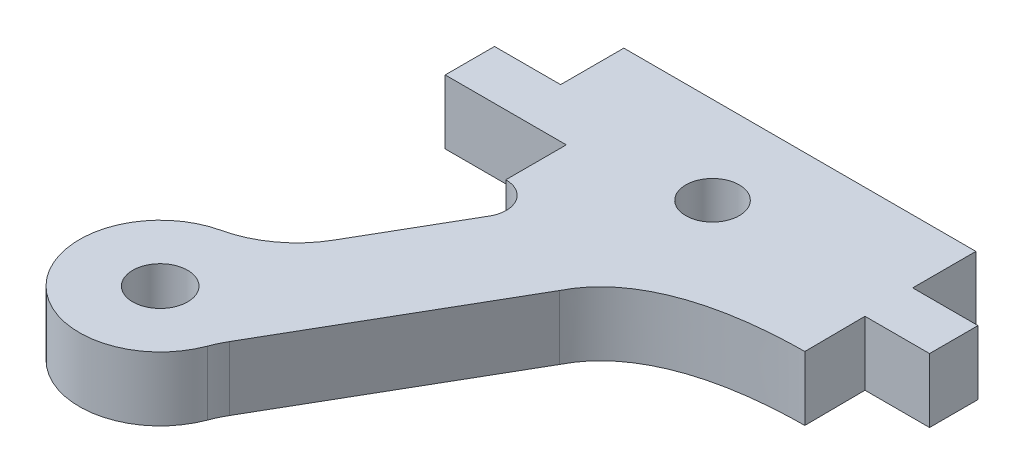
ISO-10303-21;
HEADER;
FILE_DESCRIPTION(('STEP AP214'),'2;1');
FILE_NAME('part.step','',(''),(''),'','','');
FILE_SCHEMA(('AUTOMOTIVE_DESIGN { 1 0 10303 214 1 1 1 1 }'));
ENDSEC;
DATA;
#1=APPLICATION_CONTEXT('core data for automotive mechanical design processes');
#2=APPLICATION_PROTOCOL_DEFINITION('international standard','automotive_design',2000,#1);
#3=PRODUCT_CONTEXT('',#1,'mechanical');
#4=PRODUCT('Part','Part','',(#3));
#5=PRODUCT_RELATED_PRODUCT_CATEGORY('part','',(#4));
#6=PRODUCT_DEFINITION_FORMATION('','',#4);
#7=PRODUCT_DEFINITION_CONTEXT('part definition',#1,'design');
#8=PRODUCT_DEFINITION('design','',#6,#7);
#9=PRODUCT_DEFINITION_SHAPE('','',#8);
#10=(LENGTH_UNIT() NAMED_UNIT(*) SI_UNIT(.MILLI.,.METRE.));
#11=(NAMED_UNIT(*) PLANE_ANGLE_UNIT() SI_UNIT($,.RADIAN.));
#12=(NAMED_UNIT(*) SI_UNIT($,.STERADIAN.) SOLID_ANGLE_UNIT());
#13=UNCERTAINTY_MEASURE_WITH_UNIT(LENGTH_MEASURE(1.E-05),#10,'distance_accuracy_value','');
#14=(GEOMETRIC_REPRESENTATION_CONTEXT(3) GLOBAL_UNCERTAINTY_ASSIGNED_CONTEXT((#13)) GLOBAL_UNIT_ASSIGNED_CONTEXT((#10,
#11,#12)) REPRESENTATION_CONTEXT('',''));
#15=CARTESIAN_POINT('',(0.,0.,0.));
#16=DIRECTION('',(0.,0.,1.));
#17=DIRECTION('',(1.,0.,0.));
#18=AXIS2_PLACEMENT_3D('',#15,#16,#17);
#19=CARTESIAN_POINT('',(117.147916967197,3.175,-107.308257011216));
#20=DIRECTION('',(0.,-1.,0.));
#21=DIRECTION('',(0.,0.,-1.));
#22=AXIS2_PLACEMENT_3D('',#19,#20,#21);
#23=PLANE('',#22);
#24=CARTESIAN_POINT('',(108.7226006299,3.175,-110.472754541073));
#25=DIRECTION('',(0.,1.,0.));
#26=DIRECTION('',(0.,0.,1.));
#27=AXIS2_PLACEMENT_3D('',#24,#25,#26);
#28=CIRCLE('',#27,1.36);
#29=CARTESIAN_POINT('',(108.7226006299,3.175,-109.112754541073));
#30=VERTEX_POINT('',#29);
#31=EDGE_CURVE('E195',#30,#30,#28,.T.);
#32=ORIENTED_EDGE('',*,*,#31,.F.);
#33=EDGE_LOOP('',(#32));
#34=FACE_BOUND('',#33,.T.);
#35=CARTESIAN_POINT('',(117.147916967197,3.175,-107.308257011216));
#36=DIRECTION('',(0.,-1.,0.));
#37=DIRECTION('',(0.,0.,-1.));
#38=AXIS2_PLACEMENT_3D('',#35,#36,#37);
#39=CIRCLE('',#38,5.00000000000112);
#40=CARTESIAN_POINT('',(112.467185668698,3.175,-109.066311194469));
#41=VERTEX_POINT('',#40);
#42=CARTESIAN_POINT('',(112.817819601477,3.175,-109.808308371367));
#43=VERTEX_POINT('',#42);
#44=EDGE_CURVE('E231',#41,#43,#39,.T.);
#45=ORIENTED_EDGE('',*,*,#44,.T.);
#46=DIRECTION('',(0.500010272030281,0.,-0.866019473143765));
#47=VECTOR('',#46,1.);
#48=CARTESIAN_POINT('',(118.803678696097,3.175,-120.175836459114));
#49=LINE('',#48,#47);
#50=CARTESIAN_POINT('',(118.803678696098,3.175,-120.175836459113));
#51=VERTEX_POINT('',#50);
#52=EDGE_CURVE('E124',#43,#51,#49,.T.);
#53=ORIENTED_EDGE('',*,*,#52,.T.);
#54=CARTESIAN_POINT('',(118.803678696098,3.175,-120.175836459113));
#55=CARTESIAN_POINT('',(120.361778696098,3.175,-123.269636459114));
#56=CARTESIAN_POINT('',(125.055778696098,3.175,-123.618636459114));
#57=CARTESIAN_POINT('',(127.497578696098,3.175,-123.636436459114));
#58=B_SPLINE_CURVE_WITH_KNOTS('',3,(#54,#55,#56,#57),.UNSPECIFIED.,.F.,.F.,(4,4),
(0.666666666666667,0.708333333333333),.UNSPECIFIED.);
#59=CARTESIAN_POINT('',(127.497578696098,3.175,-123.636436459114));
#60=VERTEX_POINT('',#59);
#61=EDGE_CURVE('E276',#51,#60,#58,.T.);
#62=ORIENTED_EDGE('',*,*,#61,.T.);
#63=DIRECTION('',(-0.00719981338325912,0.,-0.999974081007726));
#64=VECTOR('',#63,1.);
#65=CARTESIAN_POINT('',(127.475978696098,3.175,-126.636436459114));
#66=LINE('',#65,#64);
#67=CARTESIAN_POINT('',(127.475978696098,3.175,-126.636436459114));
#68=VERTEX_POINT('',#67);
#69=EDGE_CURVE('E295',#60,#68,#66,.T.);
#70=ORIENTED_EDGE('',*,*,#69,.T.);
#71=DIRECTION('',(1.,0.,0.));
#72=VECTOR('',#71,1.);
#73=CARTESIAN_POINT('',(130.675779855545,3.175,-126.636436459114));
#74=LINE('',#73,#72);
#75=CARTESIAN_POINT('',(130.675779855545,3.175,-126.636436459114));
#76=VERTEX_POINT('',#75);
#77=EDGE_CURVE('E292',#68,#76,#74,.T.);
#78=ORIENTED_EDGE('',*,*,#77,.T.);
#79=DIRECTION('',(0.,0.,-1.));
#80=VECTOR('',#79,1.);
#81=CARTESIAN_POINT('',(130.675779855545,3.175,-129.036436459114));
#82=LINE('',#81,#80);
#83=CARTESIAN_POINT('',(130.675779855545,3.175,-129.036436459114));
#84=VERTEX_POINT('',#83);
#85=EDGE_CURVE('E294',#76,#84,#82,.T.);
#86=ORIENTED_EDGE('',*,*,#85,.T.);
#87=DIRECTION('',(-1.,0.,0.));
#88=VECTOR('',#87,1.);
#89=CARTESIAN_POINT('',(130.675779855545,3.175,-129.036436459114));
#90=LINE('',#89,#88);
#91=CARTESIAN_POINT('',(127.440025110759,3.175,-129.036436459114));
#92=VERTEX_POINT('',#91);
#93=EDGE_CURVE('E297',#84,#92,#90,.T.);
#94=ORIENTED_EDGE('',*,*,#93,.T.);
#95=DIRECTION('',(0.,0.,-1.));
#96=VECTOR('',#95,1.);
#97=CARTESIAN_POINT('',(127.440025110759,3.175,-129.036436459114));
#98=LINE('',#97,#96);
#99=CARTESIAN_POINT('',(127.440025110759,3.175,-132.168236459114));
#100=VERTEX_POINT('',#99);
#101=EDGE_CURVE('E303',#92,#100,#98,.T.);
#102=ORIENTED_EDGE('',*,*,#101,.T.);
#103=DIRECTION('',(-1.,0.,0.));
#104=VECTOR('',#103,1.);
#105=CARTESIAN_POINT('',(109.997615957605,3.175,-132.168236459114));
#106=LINE('',#105,#104);
#107=CARTESIAN_POINT('',(109.997615957605,3.175,-132.168236459114));
#108=VERTEX_POINT('',#107);
#109=EDGE_CURVE('E305',#100,#108,#106,.T.);
#110=ORIENTED_EDGE('',*,*,#109,.T.);
#111=DIRECTION('',(0.,0.,1.));
#112=VECTOR('',#111,1.);
#113=CARTESIAN_POINT('',(109.997615957605,3.175,-129.036436459114));
#114=LINE('',#113,#112);
#115=CARTESIAN_POINT('',(109.997615957605,3.175,-129.036436459114));
#116=VERTEX_POINT('',#115);
#117=EDGE_CURVE('E307',#108,#116,#114,.T.);
#118=ORIENTED_EDGE('',*,*,#117,.T.);
#119=DIRECTION('',(-1.,0.,0.));
#120=VECTOR('',#119,1.);
#121=CARTESIAN_POINT('',(106.722915957605,3.175,-129.036436459114));
#122=LINE('',#121,#120);
#123=CARTESIAN_POINT('',(106.722915957605,3.175,-129.036436459114));
#124=VERTEX_POINT('',#123);
#125=EDGE_CURVE('E309',#116,#124,#122,.T.);
#126=ORIENTED_EDGE('',*,*,#125,.T.);
#127=DIRECTION('',(0.,0.,1.));
#128=VECTOR('',#127,1.);
#129=CARTESIAN_POINT('',(106.722915957605,3.175,-129.036436459114));
#130=LINE('',#129,#128);
#131=CARTESIAN_POINT('',(106.722915957605,3.175,-126.593302227627));
#132=VERTEX_POINT('',#131);
#133=EDGE_CURVE('E311',#124,#132,#130,.T.);
#134=ORIENTED_EDGE('',*,*,#133,.T.);
#135=DIRECTION('',(1.,0.,0.));
#136=VECTOR('',#135,1.);
#137=CARTESIAN_POINT('',(112.722877294147,3.175,-126.593302227627));
#138=LINE('',#137,#136);
#139=CARTESIAN_POINT('',(112.722877294147,3.175,-126.593302227627));
#140=VERTEX_POINT('',#139);
#141=EDGE_CURVE('E313',#132,#140,#138,.T.);
#142=ORIENTED_EDGE('',*,*,#141,.T.);
#143=DIRECTION('',(-3.36371008937517E-05,0.,0.999999999434273));
#144=VECTOR('',#143,1.);
#145=CARTESIAN_POINT('',(112.722877294147,3.175,-126.593302227627));
#146=LINE('',#145,#144);
#147=CARTESIAN_POINT('',(112.722776380156,3.175,-123.593222295389));
#148=VERTEX_POINT('',#147);
#149=EDGE_CURVE('E315',#140,#148,#146,.T.);
#150=ORIENTED_EDGE('',*,*,#149,.T.);
#151=CARTESIAN_POINT('',(112.746841426835,3.175,-122.290489268781));
#152=DIRECTION('',(0.,-1.,0.));
#153=DIRECTION('',(0.,0.,-1.));
#154=AXIS2_PLACEMENT_3D('',#151,#152,#153);
#155=CIRCLE('',#154,1.30295528130786);
#156=CARTESIAN_POINT('',(113.863024117118,3.175,-121.618307249532));
#157=VERTEX_POINT('',#156);
#158=EDGE_CURVE('E173',#148,#157,#155,.T.);
#159=ORIENTED_EDGE('',*,*,#158,.T.);
#160=DIRECTION('',(-0.500007031483039,0.,0.866021344117753));
#161=VECTOR('',#160,1.);
#162=CARTESIAN_POINT('',(113.863024117118,3.175,-121.618307249532));
#163=LINE('',#162,#161);
#164=CARTESIAN_POINT('',(111.050643934472,3.175,-116.747213219672));
#165=VERTEX_POINT('',#164);
#166=EDGE_CURVE('E167',#157,#165,#163,.T.);
#167=ORIENTED_EDGE('',*,*,#166,.T.);
#168=CARTESIAN_POINT('',(106.720537213884,3.175,-119.247248377087));
#169=DIRECTION('',(0.,-1.,0.));
#170=DIRECTION('',(0.,0.,1.));
#171=AXIS2_PLACEMENT_3D('',#168,#169,#170);
#172=CIRCLE('',#171,4.99999999999933);
#173=CARTESIAN_POINT('',(107.832794667225,3.175,-114.372529579301));
#174=VERTEX_POINT('',#173);
#175=EDGE_CURVE('E171',#165,#174,#172,.T.);
#176=ORIENTED_EDGE('',*,*,#175,.T.);
#177=CARTESIAN_POINT('',(108.7226006299,3.175,-110.472754541073));
#178=DIRECTION('',(0.,1.,0.));
#179=DIRECTION('',(0.,0.,1.));
#180=AXIS2_PLACEMENT_3D('',#177,#178,#179);
#181=CIRCLE('',#180,3.99999999999977);
#182=EDGE_CURVE('E51',#174,#41,#181,.T.);
#183=ORIENTED_EDGE('',*,*,#182,.T.);
#184=EDGE_LOOP('',(#45,#53,#62,#70,#78,#86,#94,#102,#110,#118,#126,#134,#142,#150,#159,#167,
#176,#183));
#185=FACE_BOUND('',#184,.T.);
#186=CARTESIAN_POINT('',(118.723210584464,3.175,-127.836436459114));
#187=DIRECTION('',(0.,1.,0.));
#188=DIRECTION('',(0.,0.,1.));
#189=AXIS2_PLACEMENT_3D('',#186,#187,#188);
#190=CIRCLE('',#189,1.32501209994475);
#191=CARTESIAN_POINT('',(118.723210584464,3.175,-126.511424359169));
#192=VERTEX_POINT('',#191);
#193=EDGE_CURVE('E358',#192,#192,#190,.T.);
#194=ORIENTED_EDGE('',*,*,#193,.F.);
#195=EDGE_LOOP('',(#194));
#196=FACE_BOUND('',#195,.T.);
#197=ADVANCED_FACE('F34',(#34,#185,#196),#23,.F.);
#198=CARTESIAN_POINT('',(117.147916967197,0.,-107.308257011216));
#199=DIRECTION('',(0.,-1.,0.));
#200=DIRECTION('',(0.,0.,-1.));
#201=AXIS2_PLACEMENT_3D('',#198,#199,#200);
#202=PLANE('',#201);
#203=CARTESIAN_POINT('',(108.7226006299,0.,-110.472754541073));
#204=DIRECTION('',(0.,1.,0.));
#205=DIRECTION('',(0.,0.,1.));
#206=AXIS2_PLACEMENT_3D('',#203,#204,#205);
#207=CIRCLE('',#206,1.36);
#208=CARTESIAN_POINT('',(108.7226006299,0.,-109.112754541073));
#209=VERTEX_POINT('',#208);
#210=EDGE_CURVE('E363',#209,#209,#207,.T.);
#211=ORIENTED_EDGE('',*,*,#210,.T.);
#212=EDGE_LOOP('',(#211));
#213=FACE_BOUND('',#212,.T.);
#214=CARTESIAN_POINT('',(117.147916967197,0.,-107.308257011216));
#215=DIRECTION('',(0.,-1.,0.));
#216=DIRECTION('',(0.,0.,-1.));
#217=AXIS2_PLACEMENT_3D('',#214,#215,#216);
#218=CIRCLE('',#217,5.00000000000112);
#219=CARTESIAN_POINT('',(112.467185668698,0.,-109.066311194469));
#220=VERTEX_POINT('',#219);
#221=CARTESIAN_POINT('',(112.817819601477,0.,-109.808308371367));
#222=VERTEX_POINT('',#221);
#223=EDGE_CURVE('E191',#220,#222,#218,.T.);
#224=ORIENTED_EDGE('',*,*,#223,.F.);
#225=CARTESIAN_POINT('',(108.7226006299,0.,-110.472754541073));
#226=DIRECTION('',(0.,1.,0.));
#227=DIRECTION('',(0.,0.,1.));
#228=AXIS2_PLACEMENT_3D('',#225,#226,#227);
#229=CIRCLE('',#228,3.99999999999977);
#230=CARTESIAN_POINT('',(107.832794667225,0.,-114.372529579301));
#231=VERTEX_POINT('',#230);
#232=EDGE_CURVE('E116',#231,#220,#229,.T.);
#233=ORIENTED_EDGE('',*,*,#232,.F.);
#234=CARTESIAN_POINT('',(106.720537213884,0.,-119.247248377087));
#235=DIRECTION('',(0.,-1.,0.));
#236=DIRECTION('',(0.,0.,1.));
#237=AXIS2_PLACEMENT_3D('',#234,#235,#236);
#238=CIRCLE('',#237,4.99999999999933);
#239=CARTESIAN_POINT('',(111.050643934472,0.,-116.747213219672));
#240=VERTEX_POINT('',#239);
#241=EDGE_CURVE('E110',#240,#231,#238,.T.);
#242=ORIENTED_EDGE('',*,*,#241,.F.);
#243=DIRECTION('',(-0.500007031483039,0.,0.866021344117753));
#244=VECTOR('',#243,1.);
#245=CARTESIAN_POINT('',(113.863024117118,0.,-121.618307249532));
#246=LINE('',#245,#244);
#247=CARTESIAN_POINT('',(113.863024117118,0.,-121.618307249532));
#248=VERTEX_POINT('',#247);
#249=EDGE_CURVE('E181',#248,#240,#246,.T.);
#250=ORIENTED_EDGE('',*,*,#249,.F.);
#251=CARTESIAN_POINT('',(112.746841426835,0.,-122.290489268781));
#252=DIRECTION('',(0.,-1.,0.));
#253=DIRECTION('',(0.,0.,-1.));
#254=AXIS2_PLACEMENT_3D('',#251,#252,#253);
#255=CIRCLE('',#254,1.30295528130786);
#256=CARTESIAN_POINT('',(112.722776380156,0.,-123.593222295389));
#257=VERTEX_POINT('',#256);
#258=EDGE_CURVE('E226',#257,#248,#255,.T.);
#259=ORIENTED_EDGE('',*,*,#258,.F.);
#260=DIRECTION('',(-3.36371008937517E-05,0.,0.999999999434273));
#261=VECTOR('',#260,1.);
#262=CARTESIAN_POINT('',(112.722877294147,0.,-126.593302227627));
#263=LINE('',#262,#261);
#264=CARTESIAN_POINT('',(112.722877294147,0.,-126.593302227627));
#265=VERTEX_POINT('',#264);
#266=EDGE_CURVE('E224',#265,#257,#263,.T.);
#267=ORIENTED_EDGE('',*,*,#266,.F.);
#268=DIRECTION('',(1.,0.,0.));
#269=VECTOR('',#268,1.);
#270=CARTESIAN_POINT('',(112.722877294147,0.,-126.593302227627));
#271=LINE('',#270,#269);
#272=CARTESIAN_POINT('',(106.722915957605,0.,-126.593302227627));
#273=VERTEX_POINT('',#272);
#274=EDGE_CURVE('E222',#273,#265,#271,.T.);
#275=ORIENTED_EDGE('',*,*,#274,.F.);
#276=DIRECTION('',(0.,0.,1.));
#277=VECTOR('',#276,1.);
#278=CARTESIAN_POINT('',(106.722915957605,0.,-129.036436459114));
#279=LINE('',#278,#277);
#280=CARTESIAN_POINT('',(106.722915957605,0.,-129.036436459114));
#281=VERTEX_POINT('',#280);
#282=EDGE_CURVE('E220',#281,#273,#279,.T.);
#283=ORIENTED_EDGE('',*,*,#282,.F.);
#284=DIRECTION('',(-1.,0.,0.));
#285=VECTOR('',#284,1.);
#286=CARTESIAN_POINT('',(106.722915957605,0.,-129.036436459114));
#287=LINE('',#286,#285);
#288=CARTESIAN_POINT('',(109.997615957605,0.,-129.036436459114));
#289=VERTEX_POINT('',#288);
#290=EDGE_CURVE('E218',#289,#281,#287,.T.);
#291=ORIENTED_EDGE('',*,*,#290,.F.);
#292=DIRECTION('',(0.,0.,1.));
#293=VECTOR('',#292,1.);
#294=CARTESIAN_POINT('',(109.997615957605,0.,-129.036436459114));
#295=LINE('',#294,#293);
#296=CARTESIAN_POINT('',(109.997615957605,0.,-132.168236459114));
#297=VERTEX_POINT('',#296);
#298=EDGE_CURVE('E216',#297,#289,#295,.T.);
#299=ORIENTED_EDGE('',*,*,#298,.F.);
#300=DIRECTION('',(-1.,0.,0.));
#301=VECTOR('',#300,1.);
#302=CARTESIAN_POINT('',(109.997615957605,0.,-132.168236459114));
#303=LINE('',#302,#301);
#304=CARTESIAN_POINT('',(127.440025110759,0.,-132.168236459114));
#305=VERTEX_POINT('',#304);
#306=EDGE_CURVE('E214',#305,#297,#303,.T.);
#307=ORIENTED_EDGE('',*,*,#306,.F.);
#308=DIRECTION('',(0.,0.,-1.));
#309=VECTOR('',#308,1.);
#310=CARTESIAN_POINT('',(127.440025110759,0.,-129.036436459114));
#311=LINE('',#310,#309);
#312=CARTESIAN_POINT('',(127.440025110759,0.,-129.036436459114));
#313=VERTEX_POINT('',#312);
#314=EDGE_CURVE('E212',#313,#305,#311,.T.);
#315=ORIENTED_EDGE('',*,*,#314,.F.);
#316=DIRECTION('',(-1.,0.,0.));
#317=VECTOR('',#316,1.);
#318=CARTESIAN_POINT('',(130.675779855545,0.,-129.036436459114));
#319=LINE('',#318,#317);
#320=CARTESIAN_POINT('',(130.675779855545,0.,-129.036436459114));
#321=VERTEX_POINT('',#320);
#322=EDGE_CURVE('E210',#321,#313,#319,.T.);
#323=ORIENTED_EDGE('',*,*,#322,.F.);
#324=DIRECTION('',(0.,0.,-1.));
#325=VECTOR('',#324,1.);
#326=CARTESIAN_POINT('',(130.675779855545,0.,-129.036436459114));
#327=LINE('',#326,#325);
#328=CARTESIAN_POINT('',(130.675779855545,0.,-126.636436459114));
#329=VERTEX_POINT('',#328);
#330=EDGE_CURVE('E208',#329,#321,#327,.T.);
#331=ORIENTED_EDGE('',*,*,#330,.F.);
#332=DIRECTION('',(1.,0.,0.));
#333=VECTOR('',#332,1.);
#334=CARTESIAN_POINT('',(130.675779855545,0.,-126.636436459114));
#335=LINE('',#334,#333);
#336=CARTESIAN_POINT('',(127.475978696098,0.,-126.636436459114));
#337=VERTEX_POINT('',#336);
#338=EDGE_CURVE('E206',#337,#329,#335,.T.);
#339=ORIENTED_EDGE('',*,*,#338,.F.);
#340=DIRECTION('',(-0.00719981338325912,0.,-0.999974081007726));
#341=VECTOR('',#340,1.);
#342=CARTESIAN_POINT('',(127.475978696098,0.,-126.636436459114));
#343=LINE('',#342,#341);
#344=CARTESIAN_POINT('',(127.497578696098,0.,-123.636436459114));
#345=VERTEX_POINT('',#344);
#346=EDGE_CURVE('E201',#345,#337,#343,.T.);
#347=ORIENTED_EDGE('',*,*,#346,.F.);
#348=CARTESIAN_POINT('',(118.803678696098,0.,-120.175836459113));
#349=CARTESIAN_POINT('',(120.361778696098,0.,-123.269636459114));
#350=CARTESIAN_POINT('',(125.055778696098,0.,-123.618636459114));
#351=CARTESIAN_POINT('',(127.497578696098,0.,-123.636436459114));
#352=B_SPLINE_CURVE_WITH_KNOTS('',3,(#348,#349,#350,#351),.UNSPECIFIED.,.F.,.F.,(4,4),
(0.666666666666667,0.708333333333333),.UNSPECIFIED.);
#353=CARTESIAN_POINT('',(118.803678696098,0.,-120.175836459113));
#354=VERTEX_POINT('',#353);
#355=EDGE_CURVE('E197',#354,#345,#352,.T.);
#356=ORIENTED_EDGE('',*,*,#355,.F.);
#357=DIRECTION('',(0.500010272030281,0.,-0.866019473143765));
#358=VECTOR('',#357,1.);
#359=CARTESIAN_POINT('',(118.803678696097,0.,-120.175836459114));
#360=LINE('',#359,#358);
#361=EDGE_CURVE('E194',#222,#354,#360,.T.);
#362=ORIENTED_EDGE('',*,*,#361,.F.);
#363=EDGE_LOOP('',(#224,#233,#242,#250,#259,#267,#275,#283,#291,#299,#307,#315,#323,#331,#339,
#347,#356,#362));
#364=FACE_BOUND('',#363,.T.);
#365=CARTESIAN_POINT('',(118.723210584464,0.,-127.836436459114));
#366=DIRECTION('',(0.,1.,0.));
#367=DIRECTION('',(0.,0.,1.));
#368=AXIS2_PLACEMENT_3D('',#365,#366,#367);
#369=CIRCLE('',#368,1.32501209994475);
#370=CARTESIAN_POINT('',(118.723210584464,0.,-126.511424359169));
#371=VERTEX_POINT('',#370);
#372=EDGE_CURVE('E361',#371,#371,#369,.T.);
#373=ORIENTED_EDGE('',*,*,#372,.T.);
#374=EDGE_LOOP('',(#373));
#375=FACE_BOUND('',#374,.T.);
#376=ADVANCED_FACE('F280',(#213,#364,#375),#202,.T.);
#377=CARTESIAN_POINT('',(117.147916967197,3.175,-107.308257011216));
#378=DIRECTION('',(0.,-1.,0.));
#379=DIRECTION('',(0.,0.,-1.));
#380=AXIS2_PLACEMENT_3D('',#377,#378,#379);
#381=CYLINDRICAL_SURFACE('',#380,5.00000000000112);
#382=ORIENTED_EDGE('',*,*,#223,.T.);
#383=DIRECTION('',(0.,-1.,0.));
#384=VECTOR('',#383,1.);
#385=CARTESIAN_POINT('',(112.817819601477,3.175,-109.808308371367));
#386=LINE('',#385,#384);
#387=EDGE_CURVE('E11',#43,#222,#386,.T.);
#388=ORIENTED_EDGE('',*,*,#387,.F.);
#389=ORIENTED_EDGE('',*,*,#44,.F.);
#390=DIRECTION('',(0.,-1.,0.));
#391=VECTOR('',#390,1.);
#392=CARTESIAN_POINT('',(112.467185668698,3.175,-109.066311194469));
#393=LINE('',#392,#391);
#394=EDGE_CURVE('E187',#41,#220,#393,.T.);
#395=ORIENTED_EDGE('',*,*,#394,.T.);
#396=EDGE_LOOP('',(#382,#388,#389,#395));
#397=FACE_BOUND('',#396,.T.);
#398=ADVANCED_FACE('F36',(#397),#381,.F.);
#399=CARTESIAN_POINT('',(118.803678696097,3.175,-120.175836459114));
#400=DIRECTION('',(-0.866019473143765,0.,-0.500010272030281));
#401=DIRECTION('',(-0.500010272030281,0.,0.866019473143765));
#402=AXIS2_PLACEMENT_3D('',#399,#400,#401);
#403=PLANE('',#402);
#404=ORIENTED_EDGE('',*,*,#361,.T.);
#405=DIRECTION('',(0.,-1.,0.));
#406=VECTOR('',#405,1.);
#407=CARTESIAN_POINT('',(118.803678696098,3.175,-120.175836459113));
#408=LINE('',#407,#406);
#409=EDGE_CURVE('E43',#51,#354,#408,.T.);
#410=ORIENTED_EDGE('',*,*,#409,.F.);
#411=ORIENTED_EDGE('',*,*,#52,.F.);
#412=ORIENTED_EDGE('',*,*,#387,.T.);
#413=EDGE_LOOP('',(#404,#410,#411,#412));
#414=FACE_BOUND('',#413,.T.);
#415=ADVANCED_FACE('F380',(#414),#403,.F.);
#416=DIRECTION('',(0.,-1.,0.));
#417=VECTOR('',#416,1.);
#418=SURFACE_OF_LINEAR_EXTRUSION('',#58,#417);
#419=ORIENTED_EDGE('',*,*,#355,.T.);
#420=DIRECTION('',(0.,-1.,0.));
#421=VECTOR('',#420,1.);
#422=CARTESIAN_POINT('',(127.497578696098,3.175,-123.636436459114));
#423=LINE('',#422,#421);
#424=EDGE_CURVE('E268',#60,#345,#423,.T.);
#425=ORIENTED_EDGE('',*,*,#424,.F.);
#426=ORIENTED_EDGE('',*,*,#61,.F.);
#427=ORIENTED_EDGE('',*,*,#409,.T.);
#428=EDGE_LOOP('',(#419,#425,#426,#427));
#429=FACE_BOUND('',#428,.T.);
#430=ADVANCED_FACE('F274',(#429),#418,.F.);
#431=CARTESIAN_POINT('',(127.475978696098,3.175,-126.636436459114));
#432=DIRECTION('',(-0.999974081007726,0.,0.00719981338325912));
#433=DIRECTION('',(0.00719981338325912,0.,0.999974081007726));
#434=AXIS2_PLACEMENT_3D('',#431,#432,#433);
#435=PLANE('',#434);
#436=ORIENTED_EDGE('',*,*,#346,.T.);
#437=DIRECTION('',(0.,-1.,0.));
#438=VECTOR('',#437,1.);
#439=CARTESIAN_POINT('',(127.475978696098,3.175,-126.636436459114));
#440=LINE('',#439,#438);
#441=EDGE_CURVE('E265',#68,#337,#440,.T.);
#442=ORIENTED_EDGE('',*,*,#441,.F.);
#443=ORIENTED_EDGE('',*,*,#69,.F.);
#444=ORIENTED_EDGE('',*,*,#424,.T.);
#445=EDGE_LOOP('',(#436,#442,#443,#444));
#446=FACE_BOUND('',#445,.T.);
#447=ADVANCED_FACE('F286',(#446),#435,.F.);
#448=CARTESIAN_POINT('',(130.675779855545,3.175,-126.636436459114));
#449=DIRECTION('',(0.,0.,-1.));
#450=DIRECTION('',(-1.,0.,0.));
#451=AXIS2_PLACEMENT_3D('',#448,#449,#450);
#452=PLANE('',#451);
#453=ORIENTED_EDGE('',*,*,#338,.T.);
#454=DIRECTION('',(0.,-1.,0.));
#455=VECTOR('',#454,1.);
#456=CARTESIAN_POINT('',(130.675779855545,3.175,-126.636436459114));
#457=LINE('',#456,#455);
#458=EDGE_CURVE('E262',#76,#329,#457,.T.);
#459=ORIENTED_EDGE('',*,*,#458,.F.);
#460=ORIENTED_EDGE('',*,*,#77,.F.);
#461=ORIENTED_EDGE('',*,*,#441,.T.);
#462=EDGE_LOOP('',(#453,#459,#460,#461));
#463=FACE_BOUND('',#462,.T.);
#464=ADVANCED_FACE('F290',(#463),#452,.F.);
#465=CARTESIAN_POINT('',(130.675779855545,3.175,-129.036436459114));
#466=DIRECTION('',(-1.,0.,0.));
#467=DIRECTION('',(0.,0.,1.));
#468=AXIS2_PLACEMENT_3D('',#465,#466,#467);
#469=PLANE('',#468);
#470=ORIENTED_EDGE('',*,*,#330,.T.);
#471=DIRECTION('',(0.,-1.,0.));
#472=VECTOR('',#471,1.);
#473=CARTESIAN_POINT('',(130.675779855545,3.175,-129.036436459114));
#474=LINE('',#473,#472);
#475=EDGE_CURVE('E259',#84,#321,#474,.T.);
#476=ORIENTED_EDGE('',*,*,#475,.F.);
#477=ORIENTED_EDGE('',*,*,#85,.F.);
#478=ORIENTED_EDGE('',*,*,#458,.T.);
#479=EDGE_LOOP('',(#470,#476,#477,#478));
#480=FACE_BOUND('',#479,.T.);
#481=ADVANCED_FACE('F423',(#480),#469,.F.);
#482=CARTESIAN_POINT('',(130.675779855545,3.175,-129.036436459114));
#483=DIRECTION('',(0.,0.,1.));
#484=DIRECTION('',(1.,0.,0.));
#485=AXIS2_PLACEMENT_3D('',#482,#483,#484);
#486=PLANE('',#485);
#487=ORIENTED_EDGE('',*,*,#322,.T.);
#488=DIRECTION('',(0.,-1.,0.));
#489=VECTOR('',#488,1.);
#490=CARTESIAN_POINT('',(127.440025110759,3.175,-129.036436459114));
#491=LINE('',#490,#489);
#492=EDGE_CURVE('E256',#92,#313,#491,.T.);
#493=ORIENTED_EDGE('',*,*,#492,.F.);
#494=ORIENTED_EDGE('',*,*,#93,.F.);
#495=ORIENTED_EDGE('',*,*,#475,.T.);
#496=EDGE_LOOP('',(#487,#493,#494,#495));
#497=FACE_BOUND('',#496,.T.);
#498=ADVANCED_FACE('F430',(#497),#486,.F.);
#499=CARTESIAN_POINT('',(127.440025110759,3.175,-129.036436459114));
#500=DIRECTION('',(-1.,0.,0.));
#501=DIRECTION('',(0.,0.,1.));
#502=AXIS2_PLACEMENT_3D('',#499,#500,#501);
#503=PLANE('',#502);
#504=ORIENTED_EDGE('',*,*,#314,.T.);
#505=DIRECTION('',(0.,-1.,0.));
#506=VECTOR('',#505,1.);
#507=CARTESIAN_POINT('',(127.440025110759,3.175,-132.168236459114));
#508=LINE('',#507,#506);
#509=EDGE_CURVE('E253',#100,#305,#508,.T.);
#510=ORIENTED_EDGE('',*,*,#509,.F.);
#511=ORIENTED_EDGE('',*,*,#101,.F.);
#512=ORIENTED_EDGE('',*,*,#492,.T.);
#513=EDGE_LOOP('',(#504,#510,#511,#512));
#514=FACE_BOUND('',#513,.T.);
#515=ADVANCED_FACE('F439',(#514),#503,.F.);
#516=CARTESIAN_POINT('',(109.997615957605,3.175,-132.168236459114));
#517=DIRECTION('',(0.,0.,1.));
#518=DIRECTION('',(1.,0.,0.));
#519=AXIS2_PLACEMENT_3D('',#516,#517,#518);
#520=PLANE('',#519);
#521=ORIENTED_EDGE('',*,*,#306,.T.);
#522=DIRECTION('',(0.,-1.,0.));
#523=VECTOR('',#522,1.);
#524=CARTESIAN_POINT('',(109.997615957605,3.175,-132.168236459114));
#525=LINE('',#524,#523);
#526=EDGE_CURVE('E250',#108,#297,#525,.T.);
#527=ORIENTED_EDGE('',*,*,#526,.F.);
#528=ORIENTED_EDGE('',*,*,#109,.F.);
#529=ORIENTED_EDGE('',*,*,#509,.T.);
#530=EDGE_LOOP('',(#521,#527,#528,#529));
#531=FACE_BOUND('',#530,.T.);
#532=ADVANCED_FACE('F448',(#531),#520,.F.);
#533=CARTESIAN_POINT('',(109.997615957605,3.175,-129.036436459114));
#534=DIRECTION('',(1.,0.,0.));
#535=DIRECTION('',(0.,0.,-1.));
#536=AXIS2_PLACEMENT_3D('',#533,#534,#535);
#537=PLANE('',#536);
#538=ORIENTED_EDGE('',*,*,#298,.T.);
#539=DIRECTION('',(0.,-1.,0.));
#540=VECTOR('',#539,1.);
#541=CARTESIAN_POINT('',(109.997615957605,3.175,-129.036436459114));
#542=LINE('',#541,#540);
#543=EDGE_CURVE('E247',#116,#289,#542,.T.);
#544=ORIENTED_EDGE('',*,*,#543,.F.);
#545=ORIENTED_EDGE('',*,*,#117,.F.);
#546=ORIENTED_EDGE('',*,*,#526,.T.);
#547=EDGE_LOOP('',(#538,#544,#545,#546));
#548=FACE_BOUND('',#547,.T.);
#549=ADVANCED_FACE('F457',(#548),#537,.F.);
#550=CARTESIAN_POINT('',(106.722915957605,3.175,-129.036436459114));
#551=DIRECTION('',(0.,0.,1.));
#552=DIRECTION('',(1.,0.,0.));
#553=AXIS2_PLACEMENT_3D('',#550,#551,#552);
#554=PLANE('',#553);
#555=ORIENTED_EDGE('',*,*,#290,.T.);
#556=DIRECTION('',(0.,-1.,0.));
#557=VECTOR('',#556,1.);
#558=CARTESIAN_POINT('',(106.722915957605,3.175,-129.036436459114));
#559=LINE('',#558,#557);
#560=EDGE_CURVE('E244',#124,#281,#559,.T.);
#561=ORIENTED_EDGE('',*,*,#560,.F.);
#562=ORIENTED_EDGE('',*,*,#125,.F.);
#563=ORIENTED_EDGE('',*,*,#543,.T.);
#564=EDGE_LOOP('',(#555,#561,#562,#563));
#565=FACE_BOUND('',#564,.T.);
#566=ADVANCED_FACE('F466',(#565),#554,.F.);
#567=CARTESIAN_POINT('',(106.722915957605,3.175,-129.036436459114));
#568=DIRECTION('',(1.,0.,0.));
#569=DIRECTION('',(0.,0.,-1.));
#570=AXIS2_PLACEMENT_3D('',#567,#568,#569);
#571=PLANE('',#570);
#572=ORIENTED_EDGE('',*,*,#282,.T.);
#573=DIRECTION('',(0.,-1.,0.));
#574=VECTOR('',#573,1.);
#575=CARTESIAN_POINT('',(106.722915957605,3.175,-126.593302227627));
#576=LINE('',#575,#574);
#577=EDGE_CURVE('E241',#132,#273,#576,.T.);
#578=ORIENTED_EDGE('',*,*,#577,.F.);
#579=ORIENTED_EDGE('',*,*,#133,.F.);
#580=ORIENTED_EDGE('',*,*,#560,.T.);
#581=EDGE_LOOP('',(#572,#578,#579,#580));
#582=FACE_BOUND('',#581,.T.);
#583=ADVANCED_FACE('F475',(#582),#571,.F.);
#584=CARTESIAN_POINT('',(112.722877294147,3.175,-126.593302227627));
#585=DIRECTION('',(0.,0.,-1.));
#586=DIRECTION('',(-1.,0.,0.));
#587=AXIS2_PLACEMENT_3D('',#584,#585,#586);
#588=PLANE('',#587);
#589=ORIENTED_EDGE('',*,*,#274,.T.);
#590=DIRECTION('',(0.,-1.,0.));
#591=VECTOR('',#590,1.);
#592=CARTESIAN_POINT('',(112.722877294147,3.175,-126.593302227627));
#593=LINE('',#592,#591);
#594=EDGE_CURVE('E238',#140,#265,#593,.T.);
#595=ORIENTED_EDGE('',*,*,#594,.F.);
#596=ORIENTED_EDGE('',*,*,#141,.F.);
#597=ORIENTED_EDGE('',*,*,#577,.T.);
#598=EDGE_LOOP('',(#589,#595,#596,#597));
#599=FACE_BOUND('',#598,.T.);
#600=ADVANCED_FACE('F484',(#599),#588,.F.);
#601=CARTESIAN_POINT('',(112.722877294147,3.175,-126.593302227627));
#602=DIRECTION('',(0.999999999434273,0.,3.36371008937517E-05));
#603=DIRECTION('',(3.36371008937517E-05,0.,-0.999999999434273));
#604=AXIS2_PLACEMENT_3D('',#601,#602,#603);
#605=PLANE('',#604);
#606=ORIENTED_EDGE('',*,*,#266,.T.);
#607=DIRECTION('',(0.,-1.,0.));
#608=VECTOR('',#607,1.);
#609=CARTESIAN_POINT('',(112.722776380156,3.175,-123.593222295389));
#610=LINE('',#609,#608);
#611=EDGE_CURVE('E235',#148,#257,#610,.T.);
#612=ORIENTED_EDGE('',*,*,#611,.F.);
#613=ORIENTED_EDGE('',*,*,#149,.F.);
#614=ORIENTED_EDGE('',*,*,#594,.T.);
#615=EDGE_LOOP('',(#606,#612,#613,#614));
#616=FACE_BOUND('',#615,.T.);
#617=ADVANCED_FACE('F321',(#616),#605,.F.);
#618=CARTESIAN_POINT('',(112.746841426835,3.175,-122.290489268781));
#619=DIRECTION('',(0.,-1.,0.));
#620=DIRECTION('',(0.,0.,-1.));
#621=AXIS2_PLACEMENT_3D('',#618,#619,#620);
#622=CYLINDRICAL_SURFACE('',#621,1.30295528130786);
#623=ORIENTED_EDGE('',*,*,#258,.T.);
#624=DIRECTION('',(0.,-1.,0.));
#625=VECTOR('',#624,1.);
#626=CARTESIAN_POINT('',(113.863024117118,3.175,-121.618307249532));
#627=LINE('',#626,#625);
#628=EDGE_CURVE('E182',#157,#248,#627,.T.);
#629=ORIENTED_EDGE('',*,*,#628,.F.);
#630=ORIENTED_EDGE('',*,*,#158,.F.);
#631=ORIENTED_EDGE('',*,*,#611,.T.);
#632=EDGE_LOOP('',(#623,#629,#630,#631));
#633=FACE_BOUND('',#632,.T.);
#634=ADVANCED_FACE('F325',(#633),#622,.F.);
#635=CARTESIAN_POINT('',(113.863024117118,3.175,-121.618307249532));
#636=DIRECTION('',(0.866021344117752,0.,0.500007031483039));
#637=DIRECTION('',(0.500007031483039,0.,-0.866021344117753));
#638=AXIS2_PLACEMENT_3D('',#635,#636,#637);
#639=PLANE('',#638);
#640=ORIENTED_EDGE('',*,*,#249,.T.);
#641=DIRECTION('',(0.,-1.,0.));
#642=VECTOR('',#641,1.);
#643=CARTESIAN_POINT('',(111.050643934472,3.175,-116.747213219672));
#644=LINE('',#643,#642);
#645=EDGE_CURVE('E178',#165,#240,#644,.T.);
#646=ORIENTED_EDGE('',*,*,#645,.F.);
#647=ORIENTED_EDGE('',*,*,#166,.F.);
#648=ORIENTED_EDGE('',*,*,#628,.T.);
#649=EDGE_LOOP('',(#640,#646,#647,#648));
#650=FACE_BOUND('',#649,.T.);
#651=ADVANCED_FACE('F179',(#650),#639,.F.);
#652=CARTESIAN_POINT('',(106.720537213884,3.175,-119.247248377087));
#653=DIRECTION('',(0.,-1.,0.));
#654=DIRECTION('',(0.,0.,-1.));
#655=AXIS2_PLACEMENT_3D('',#652,#653,#654);
#656=CYLINDRICAL_SURFACE('',#655,4.99999999999933);
#657=ORIENTED_EDGE('',*,*,#241,.T.);
#658=DIRECTION('',(0.,-1.,0.));
#659=VECTOR('',#658,1.);
#660=CARTESIAN_POINT('',(107.832794667225,3.175,-114.372529579301));
#661=LINE('',#660,#659);
#662=EDGE_CURVE('E183',#174,#231,#661,.T.);
#663=ORIENTED_EDGE('',*,*,#662,.F.);
#664=ORIENTED_EDGE('',*,*,#175,.F.);
#665=ORIENTED_EDGE('',*,*,#645,.T.);
#666=EDGE_LOOP('',(#657,#663,#664,#665));
#667=FACE_BOUND('',#666,.T.);
#668=ADVANCED_FACE('F185',(#667),#656,.F.);
#669=CARTESIAN_POINT('',(108.7226006299,3.175,-110.472754541073));
#670=DIRECTION('',(0.,-1.,0.));
#671=DIRECTION('',(0.,0.,-1.));
#672=AXIS2_PLACEMENT_3D('',#669,#670,#671);
#673=CYLINDRICAL_SURFACE('',#672,3.99999999999977);
#674=ORIENTED_EDGE('',*,*,#232,.T.);
#675=ORIENTED_EDGE('',*,*,#394,.F.);
#676=ORIENTED_EDGE('',*,*,#182,.F.);
#677=ORIENTED_EDGE('',*,*,#662,.T.);
#678=EDGE_LOOP('',(#674,#675,#676,#677));
#679=FACE_BOUND('',#678,.T.);
#680=ADVANCED_FACE('F329',(#679),#673,.T.);
#681=CARTESIAN_POINT('',(108.7226006299,3.175,-110.472754541073));
#682=DIRECTION('',(0.,-1.,0.));
#683=DIRECTION('',(0.,0.,-1.));
#684=AXIS2_PLACEMENT_3D('',#681,#682,#683);
#685=CYLINDRICAL_SURFACE('',#684,1.36);
#686=ORIENTED_EDGE('',*,*,#31,.T.);
#687=EDGE_LOOP('',(#686));
#688=FACE_BOUND('',#687,.T.);
#689=ORIENTED_EDGE('',*,*,#210,.F.);
#690=EDGE_LOOP('',(#689));
#691=FACE_BOUND('',#690,.T.);
#692=ADVANCED_FACE('F331',(#688,#691),#685,.F.);
#693=CARTESIAN_POINT('',(118.723210584464,3.175,-127.836436459114));
#694=DIRECTION('',(0.,-1.,0.));
#695=DIRECTION('',(0.,0.,-1.));
#696=AXIS2_PLACEMENT_3D('',#693,#694,#695);
#697=CYLINDRICAL_SURFACE('',#696,1.32501209994475);
#698=ORIENTED_EDGE('',*,*,#193,.T.);
#699=EDGE_LOOP('',(#698));
#700=FACE_BOUND('',#699,.T.);
#701=ORIENTED_EDGE('',*,*,#372,.F.);
#702=EDGE_LOOP('',(#701));
#703=FACE_BOUND('',#702,.T.);
#704=ADVANCED_FACE('F337',(#700,#703),#697,.F.);
#705=CLOSED_SHELL('',(#197,#376,#398,#415,#430,#447,#464,#481,#498,#515,#532,#549,#566,#583,
#600,#617,#634,#651,#668,#680,#692,#704));
#706=MANIFOLD_SOLID_BREP('B2',#705);
#707=ADVANCED_BREP_SHAPE_REPRESENTATION('',(#18,#706),#14);
#708=SHAPE_DEFINITION_REPRESENTATION(#9,#707);
ENDSEC;
END-ISO-10303-21;
